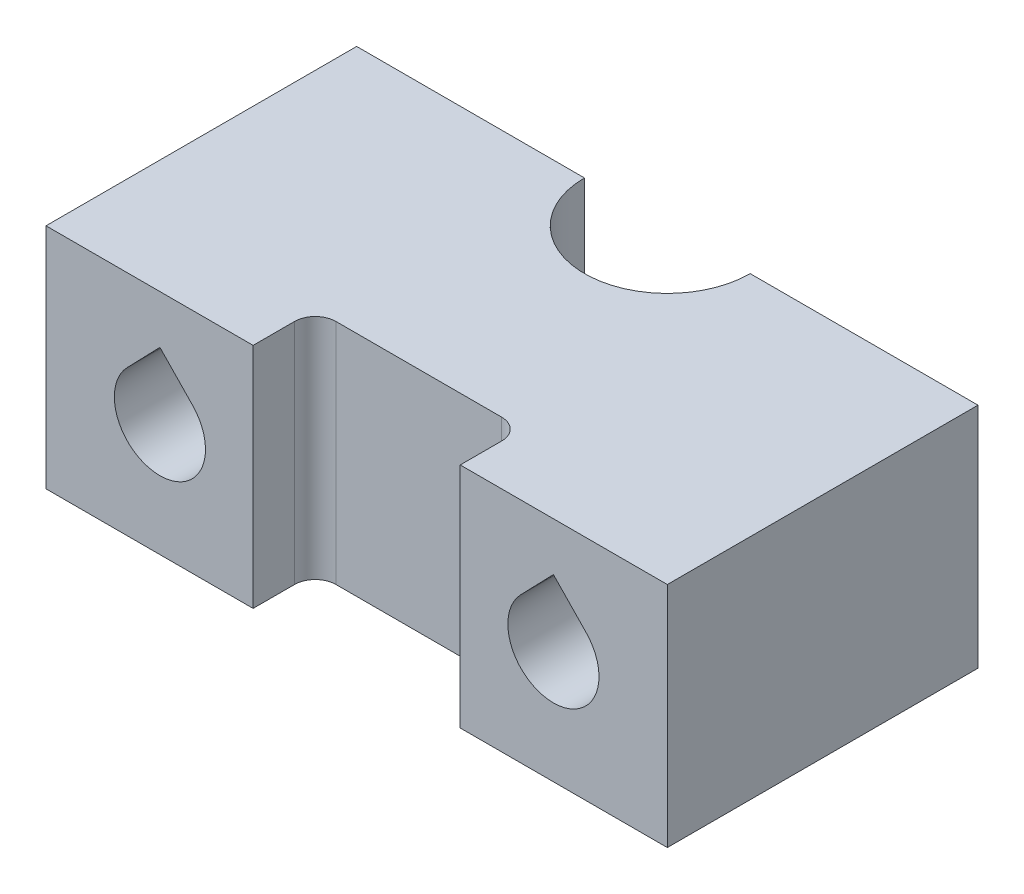
ISO-10303-21;
HEADER;
FILE_DESCRIPTION(('STEP AP214'),'2;1');
FILE_NAME('part.step','',(''),(''),'','','');
FILE_SCHEMA(('AUTOMOTIVE_DESIGN { 1 0 10303 214 1 1 1 1 }'));
ENDSEC;
DATA;
#1=APPLICATION_CONTEXT('core data for automotive mechanical design processes');
#2=APPLICATION_PROTOCOL_DEFINITION('international standard','automotive_design',2000,#1);
#3=PRODUCT_CONTEXT('',#1,'mechanical');
#4=PRODUCT('Part','Part','',(#3));
#5=PRODUCT_RELATED_PRODUCT_CATEGORY('part','',(#4));
#6=PRODUCT_DEFINITION_FORMATION('','',#4);
#7=PRODUCT_DEFINITION_CONTEXT('part definition',#1,'design');
#8=PRODUCT_DEFINITION('design','',#6,#7);
#9=PRODUCT_DEFINITION_SHAPE('','',#8);
#10=(LENGTH_UNIT() NAMED_UNIT(*) SI_UNIT(.MILLI.,.METRE.));
#11=(NAMED_UNIT(*) PLANE_ANGLE_UNIT() SI_UNIT($,.RADIAN.));
#12=(NAMED_UNIT(*) SI_UNIT($,.STERADIAN.) SOLID_ANGLE_UNIT());
#13=UNCERTAINTY_MEASURE_WITH_UNIT(LENGTH_MEASURE(1.E-05),#10,'distance_accuracy_value','');
#14=(GEOMETRIC_REPRESENTATION_CONTEXT(3) GLOBAL_UNCERTAINTY_ASSIGNED_CONTEXT((#13)) GLOBAL_UNIT_ASSIGNED_CONTEXT((#10,
#11,#12)) REPRESENTATION_CONTEXT('',''));
#15=CARTESIAN_POINT('',(0.,0.,0.));
#16=DIRECTION('',(0.,0.,1.));
#17=DIRECTION('',(1.,0.,0.));
#18=AXIS2_PLACEMENT_3D('',#15,#16,#17);
#19=CARTESIAN_POINT('',(-49.5000000000001,-25.4999999999999,25.0000000000001));
#20=DIRECTION('',(0.,0.,-1.));
#21=DIRECTION('',(-1.,0.,0.));
#22=AXIS2_PLACEMENT_3D('',#19,#20,#21);
#23=PLANE('',#22);
#24=DIRECTION('',(0.,-1.,0.));
#25=VECTOR('',#24,1.);
#26=CARTESIAN_POINT('',(-30.5,-36.4999999999999,25.0000000000001));
#27=LINE('',#26,#25);
#28=CARTESIAN_POINT('',(-30.5,-25.4999999999999,25.0000000000001));
#29=VERTEX_POINT('',#28);
#30=CARTESIAN_POINT('',(-30.5,-36.4999999999999,25.0000000000001));
#31=VERTEX_POINT('',#30);
#32=EDGE_CURVE('E156',#29,#31,#27,.T.);
#33=ORIENTED_EDGE('',*,*,#32,.F.);
#34=DIRECTION('',(1.,0.,0.));
#35=VECTOR('',#34,1.);
#36=CARTESIAN_POINT('',(-49.5000000000001,-25.4999999999999,25.0000000000001));
#37=LINE('',#36,#35);
#38=CARTESIAN_POINT('',(-19.4999999999998,-25.4999999999999,25.0000000000001));
#39=VERTEX_POINT('',#38);
#40=EDGE_CURVE('E169',#29,#39,#37,.T.);
#41=ORIENTED_EDGE('',*,*,#40,.T.);
#42=DIRECTION('',(0.,-1.,0.));
#43=VECTOR('',#42,1.);
#44=CARTESIAN_POINT('',(-19.4999999999998,-25.4999999999999,25.0000000000001));
#45=LINE('',#44,#43);
#46=CARTESIAN_POINT('',(-19.4999999999998,-36.4999999999999,25.0000000000001));
#47=VERTEX_POINT('',#46);
#48=EDGE_CURVE('E197',#39,#47,#45,.T.);
#49=ORIENTED_EDGE('',*,*,#48,.T.);
#50=DIRECTION('',(1.,0.,0.));
#51=VECTOR('',#50,1.);
#52=CARTESIAN_POINT('',(-49.5000000000001,-36.4999999999999,25.0000000000001));
#53=LINE('',#52,#51);
#54=EDGE_CURVE('E171',#31,#47,#53,.T.);
#55=ORIENTED_EDGE('',*,*,#54,.F.);
#56=EDGE_LOOP('',(#33,#41,#49,#55));
#57=FACE_BOUND('',#56,.T.);
#58=DIRECTION('',(-0.694658370458998,0.719339800338651,0.));
#59=VECTOR('',#58,1.);
#60=CARTESIAN_POINT('',(-23.4174524392547,-29.4717515849901,25.0000000000001));
#61=LINE('',#60,#59);
#62=CARTESIAN_POINT('',(-23.4174524392547,-29.4717515849901,25.0000000000001));
#63=VERTEX_POINT('',#62);
#64=CARTESIAN_POINT('',(-24.9999999999997,-27.8329756128233,25.0000000000001));
#65=VERTEX_POINT('',#64);
#66=EDGE_CURVE('E294',#63,#65,#61,.T.);
#67=ORIENTED_EDGE('',*,*,#66,.T.);
#68=DIRECTION('',(-0.694658370458998,-0.719339800338651,0.));
#69=VECTOR('',#68,1.);
#70=CARTESIAN_POINT('',(-24.9999999999997,-27.8329756128233,25.0000000000001));
#71=LINE('',#70,#69);
#72=CARTESIAN_POINT('',(-26.5825475607448,-29.4717515849901,25.0000000000001));
#73=VERTEX_POINT('',#72);
#74=EDGE_CURVE('E301',#65,#73,#71,.T.);
#75=ORIENTED_EDGE('',*,*,#74,.T.);
#76=CARTESIAN_POINT('',(-24.9999999999997,-30.9999999999999,25.0000000000001));
#77=DIRECTION('',(0.,0.,1.));
#78=DIRECTION('',(1.,0.,0.));
#79=AXIS2_PLACEMENT_3D('',#76,#77,#78);
#80=CIRCLE('',#79,2.2);
#81=EDGE_CURVE('E288',#73,#63,#80,.T.);
#82=ORIENTED_EDGE('',*,*,#81,.T.);
#83=EDGE_LOOP('',(#67,#75,#82));
#84=FACE_BOUND('',#83,.T.);
#85=ADVANCED_FACE('F30',(#57,#84),#23,.T.);
#86=CARTESIAN_POINT('',(-19.4999999999998,-25.4999999999999,40.0000000000001));
#87=DIRECTION('',(0.,0.,1.));
#88=DIRECTION('',(1.,0.,0.));
#89=AXIS2_PLACEMENT_3D('',#86,#87,#88);
#90=PLANE('',#89);
#91=CARTESIAN_POINT('',(-44.0000000000003,-30.9999999999999,40.0000000000001));
#92=DIRECTION('',(0.,0.,-1.));
#93=DIRECTION('',(-1.,0.,0.));
#94=AXIS2_PLACEMENT_3D('',#91,#92,#93);
#95=CIRCLE('',#94,2.2);
#96=CARTESIAN_POINT('',(-42.4174524392553,-29.4717515849901,40.0000000000001));
#97=VERTEX_POINT('',#96);
#98=CARTESIAN_POINT('',(-45.5825475607453,-29.4717515849901,40.0000000000001));
#99=VERTEX_POINT('',#98);
#100=EDGE_CURVE('E270',#97,#99,#95,.T.);
#101=ORIENTED_EDGE('',*,*,#100,.T.);
#102=DIRECTION('',(0.694658370458997,0.719339800338652,0.));
#103=VECTOR('',#102,1.);
#104=CARTESIAN_POINT('',(-45.5825475607453,-29.4717515849901,40.0000000000001));
#105=LINE('',#104,#103);
#106=CARTESIAN_POINT('',(-44.0000000000003,-27.8329756128233,40.0000000000001));
#107=VERTEX_POINT('',#106);
#108=EDGE_CURVE('E279',#99,#107,#105,.T.);
#109=ORIENTED_EDGE('',*,*,#108,.T.);
#110=DIRECTION('',(0.694658370458997,-0.719339800338652,0.));
#111=VECTOR('',#110,1.);
#112=CARTESIAN_POINT('',(-44.0000000000003,-27.8329756128233,40.0000000000001));
#113=LINE('',#112,#111);
#114=EDGE_CURVE('E264',#107,#97,#113,.T.);
#115=ORIENTED_EDGE('',*,*,#114,.T.);
#116=EDGE_LOOP('',(#101,#109,#115));
#117=FACE_BOUND('',#116,.T.);
#118=DIRECTION('',(0.,1.,0.));
#119=VECTOR('',#118,1.);
#120=CARTESIAN_POINT('',(-39.5,-36.4999999999999,40.0000000000001));
#121=LINE('',#120,#119);
#122=CARTESIAN_POINT('',(-39.5,-36.4999999999999,40.0000000000001));
#123=VERTEX_POINT('',#122);
#124=CARTESIAN_POINT('',(-39.5,-25.4999999999999,40.0000000000001));
#125=VERTEX_POINT('',#124);
#126=EDGE_CURVE('E247',#123,#125,#121,.T.);
#127=ORIENTED_EDGE('',*,*,#126,.T.);
#128=DIRECTION('',(-1.,0.,0.));
#129=VECTOR('',#128,1.);
#130=CARTESIAN_POINT('',(-19.4999999999998,-25.4999999999999,40.0000000000001));
#131=LINE('',#130,#129);
#132=CARTESIAN_POINT('',(-49.5000000000001,-25.4999999999999,40.0000000000001));
#133=VERTEX_POINT('',#132);
#134=EDGE_CURVE('E190',#125,#133,#131,.T.);
#135=ORIENTED_EDGE('',*,*,#134,.T.);
#136=DIRECTION('',(0.,-1.,0.));
#137=VECTOR('',#136,1.);
#138=CARTESIAN_POINT('',(-49.5000000000001,-25.4999999999999,40.0000000000001));
#139=LINE('',#138,#137);
#140=CARTESIAN_POINT('',(-49.5000000000001,-36.4999999999999,40.0000000000001));
#141=VERTEX_POINT('',#140);
#142=EDGE_CURVE('E210',#133,#141,#139,.T.);
#143=ORIENTED_EDGE('',*,*,#142,.T.);
#144=DIRECTION('',(-1.,0.,0.));
#145=VECTOR('',#144,1.);
#146=CARTESIAN_POINT('',(-19.4999999999998,-36.4999999999999,40.0000000000001));
#147=LINE('',#146,#145);
#148=EDGE_CURVE('E204',#123,#141,#147,.T.);
#149=ORIENTED_EDGE('',*,*,#148,.F.);
#150=EDGE_LOOP('',(#127,#135,#143,#149));
#151=FACE_BOUND('',#150,.T.);
#152=ADVANCED_FACE('F317',(#117,#151),#90,.T.);
#153=DIRECTION('',(0.,-1.,0.));
#154=VECTOR('',#153,1.);
#155=CARTESIAN_POINT('',(-38.5,-36.4999999999999,25.0000000000001));
#156=LINE('',#155,#154);
#157=CARTESIAN_POINT('',(-38.5,-36.4999999999999,25.0000000000001));
#158=VERTEX_POINT('',#157);
#159=CARTESIAN_POINT('',(-38.5,-25.4999999999999,25.0000000000001));
#160=VERTEX_POINT('',#159);
#161=EDGE_CURVE('E159',#158,#160,#156,.F.);
#162=ORIENTED_EDGE('',*,*,#161,.F.);
#163=CARTESIAN_POINT('',(-49.5000000000001,-36.4999999999999,25.0000000000001));
#164=VERTEX_POINT('',#163);
#165=EDGE_CURVE('E198',#164,#158,#53,.T.);
#166=ORIENTED_EDGE('',*,*,#165,.F.);
#167=DIRECTION('',(0.,-1.,0.));
#168=VECTOR('',#167,1.);
#169=CARTESIAN_POINT('',(-49.5000000000001,-25.4999999999999,25.0000000000001));
#170=LINE('',#169,#168);
#171=CARTESIAN_POINT('',(-49.5000000000001,-25.4999999999999,25.0000000000001));
#172=VERTEX_POINT('',#171);
#173=EDGE_CURVE('E207',#172,#164,#170,.T.);
#174=ORIENTED_EDGE('',*,*,#173,.F.);
#175=EDGE_CURVE('E179',#172,#160,#37,.T.);
#176=ORIENTED_EDGE('',*,*,#175,.T.);
#177=EDGE_LOOP('',(#162,#166,#174,#176));
#178=FACE_BOUND('',#177,.T.);
#179=CARTESIAN_POINT('',(-44.0000000000003,-30.9999999999999,25.0000000000001));
#180=DIRECTION('',(0.,0.,-1.));
#181=DIRECTION('',(-1.,0.,0.));
#182=AXIS2_PLACEMENT_3D('',#179,#180,#181);
#183=CIRCLE('',#182,2.2);
#184=CARTESIAN_POINT('',(-42.4174524392553,-29.4717515849901,25.0000000000001));
#185=VERTEX_POINT('',#184);
#186=CARTESIAN_POINT('',(-45.5825475607453,-29.4717515849901,25.0000000000001));
#187=VERTEX_POINT('',#186);
#188=EDGE_CURVE('E274',#185,#187,#183,.T.);
#189=ORIENTED_EDGE('',*,*,#188,.F.);
#190=DIRECTION('',(0.694658370458997,-0.719339800338652,0.));
#191=VECTOR('',#190,1.);
#192=CARTESIAN_POINT('',(-44.0000000000003,-27.8329756128233,25.0000000000001));
#193=LINE('',#192,#191);
#194=CARTESIAN_POINT('',(-44.0000000000003,-27.8329756128233,25.0000000000001));
#195=VERTEX_POINT('',#194);
#196=EDGE_CURVE('E267',#195,#185,#193,.T.);
#197=ORIENTED_EDGE('',*,*,#196,.F.);
#198=DIRECTION('',(0.694658370458997,0.719339800338652,0.));
#199=VECTOR('',#198,1.);
#200=CARTESIAN_POINT('',(-45.5825475607453,-29.4717515849901,25.0000000000001));
#201=LINE('',#200,#199);
#202=EDGE_CURVE('E271',#187,#195,#201,.T.);
#203=ORIENTED_EDGE('',*,*,#202,.F.);
#204=EDGE_LOOP('',(#189,#197,#203));
#205=FACE_BOUND('',#204,.T.);
#206=ADVANCED_FACE('F309',(#178,#205),#23,.T.);
#207=CARTESIAN_POINT('',(-49.5000000000001,-25.4999999999999,40.0000000000001));
#208=DIRECTION('',(-1.,0.,0.));
#209=DIRECTION('',(0.,0.,1.));
#210=AXIS2_PLACEMENT_3D('',#207,#208,#209);
#211=PLANE('',#210);
#212=DIRECTION('',(0.,0.,-1.));
#213=VECTOR('',#212,1.);
#214=CARTESIAN_POINT('',(-49.5000000000001,-36.4999999999999,40.0000000000001));
#215=LINE('',#214,#213);
#216=EDGE_CURVE('E180',#141,#164,#215,.T.);
#217=ORIENTED_EDGE('',*,*,#216,.F.);
#218=ORIENTED_EDGE('',*,*,#142,.F.);
#219=DIRECTION('',(0.,0.,-1.));
#220=VECTOR('',#219,1.);
#221=CARTESIAN_POINT('',(-49.5000000000001,-25.4999999999999,40.0000000000001));
#222=LINE('',#221,#220);
#223=EDGE_CURVE('E194',#133,#172,#222,.T.);
#224=ORIENTED_EDGE('',*,*,#223,.T.);
#225=ORIENTED_EDGE('',*,*,#173,.T.);
#226=EDGE_LOOP('',(#217,#218,#224,#225));
#227=FACE_BOUND('',#226,.T.);
#228=ADVANCED_FACE('F315',(#227),#211,.T.);
#229=DIRECTION('',(-0.694658370458998,0.719339800338651,0.));
#230=VECTOR('',#229,1.);
#231=CARTESIAN_POINT('',(-23.4174524392547,-29.4717515849901,40.0000000000001));
#232=LINE('',#231,#230);
#233=CARTESIAN_POINT('',(-23.4174524392547,-29.4717515849901,40.0000000000001));
#234=VERTEX_POINT('',#233);
#235=CARTESIAN_POINT('',(-24.9999999999997,-27.8329756128233,40.0000000000001));
#236=VERTEX_POINT('',#235);
#237=EDGE_CURVE('E172',#234,#236,#232,.T.);
#238=ORIENTED_EDGE('',*,*,#237,.F.);
#239=CARTESIAN_POINT('',(-24.9999999999997,-30.9999999999999,40.0000000000001));
#240=DIRECTION('',(0.,0.,1.));
#241=DIRECTION('',(1.,0.,0.));
#242=AXIS2_PLACEMENT_3D('',#239,#240,#241);
#243=CIRCLE('',#242,2.2);
#244=CARTESIAN_POINT('',(-26.5825475607448,-29.4717515849901,40.0000000000001));
#245=VERTEX_POINT('',#244);
#246=EDGE_CURVE('E291',#245,#234,#243,.T.);
#247=ORIENTED_EDGE('',*,*,#246,.F.);
#248=DIRECTION('',(-0.694658370458998,-0.719339800338651,0.));
#249=VECTOR('',#248,1.);
#250=CARTESIAN_POINT('',(-24.9999999999997,-27.8329756128233,40.0000000000001));
#251=LINE('',#250,#249);
#252=EDGE_CURVE('E295',#236,#245,#251,.T.);
#253=ORIENTED_EDGE('',*,*,#252,.F.);
#254=EDGE_LOOP('',(#238,#247,#253));
#255=FACE_BOUND('',#254,.T.);
#256=DIRECTION('',(0.,1.,0.));
#257=VECTOR('',#256,1.);
#258=CARTESIAN_POINT('',(-29.5,-36.4999999999999,40.0000000000001));
#259=LINE('',#258,#257);
#260=CARTESIAN_POINT('',(-29.5,-36.4999999999999,40.0000000000001));
#261=VERTEX_POINT('',#260);
#262=CARTESIAN_POINT('',(-29.5,-25.4999999999999,40.0000000000001));
#263=VERTEX_POINT('',#262);
#264=EDGE_CURVE('E187',#261,#263,#259,.T.);
#265=ORIENTED_EDGE('',*,*,#264,.F.);
#266=CARTESIAN_POINT('',(-19.4999999999998,-36.4999999999999,40.0000000000001));
#267=VERTEX_POINT('',#266);
#268=EDGE_CURVE('E183',#267,#261,#147,.T.);
#269=ORIENTED_EDGE('',*,*,#268,.F.);
#270=DIRECTION('',(0.,-1.,0.));
#271=VECTOR('',#270,1.);
#272=CARTESIAN_POINT('',(-19.4999999999998,-25.4999999999999,40.0000000000001));
#273=LINE('',#272,#271);
#274=CARTESIAN_POINT('',(-19.4999999999998,-25.4999999999999,40.0000000000001));
#275=VERTEX_POINT('',#274);
#276=EDGE_CURVE('E213',#275,#267,#273,.T.);
#277=ORIENTED_EDGE('',*,*,#276,.F.);
#278=EDGE_CURVE('E191',#275,#263,#131,.T.);
#279=ORIENTED_EDGE('',*,*,#278,.T.);
#280=EDGE_LOOP('',(#265,#269,#277,#279));
#281=FACE_BOUND('',#280,.T.);
#282=ADVANCED_FACE('F321',(#255,#281),#90,.T.);
#283=CARTESIAN_POINT('',(-19.4999999999998,-25.4999999999999,25.0000000000001));
#284=DIRECTION('',(1.,0.,0.));
#285=DIRECTION('',(0.,0.,-1.));
#286=AXIS2_PLACEMENT_3D('',#283,#284,#285);
#287=PLANE('',#286);
#288=DIRECTION('',(0.,0.,1.));
#289=VECTOR('',#288,1.);
#290=CARTESIAN_POINT('',(-19.4999999999998,-36.4999999999999,25.0000000000001));
#291=LINE('',#290,#289);
#292=EDGE_CURVE('E201',#47,#267,#291,.T.);
#293=ORIENTED_EDGE('',*,*,#292,.F.);
#294=ORIENTED_EDGE('',*,*,#48,.F.);
#295=DIRECTION('',(0.,0.,1.));
#296=VECTOR('',#295,1.);
#297=CARTESIAN_POINT('',(-19.4999999999998,-25.4999999999999,25.0000000000001));
#298=LINE('',#297,#296);
#299=EDGE_CURVE('E178',#39,#275,#298,.T.);
#300=ORIENTED_EDGE('',*,*,#299,.T.);
#301=ORIENTED_EDGE('',*,*,#276,.T.);
#302=EDGE_LOOP('',(#293,#294,#300,#301));
#303=FACE_BOUND('',#302,.T.);
#304=ADVANCED_FACE('F330',(#303),#287,.T.);
#305=CARTESIAN_POINT('',(-19.4999999999998,-25.4999999999999,25.0000000000001));
#306=DIRECTION('',(0.,-1.,0.));
#307=DIRECTION('',(0.,0.,-1.));
#308=AXIS2_PLACEMENT_3D('',#305,#306,#307);
#309=PLANE('',#308);
#310=ORIENTED_EDGE('',*,*,#40,.F.);
#311=CARTESIAN_POINT('',(-34.5,-25.4999999999999,25.0000000000001));
#312=DIRECTION('',(0.,-1.,0.));
#313=DIRECTION('',(0.,0.,-1.));
#314=AXIS2_PLACEMENT_3D('',#311,#312,#313);
#315=CIRCLE('',#314,4.00000000000001);
#316=EDGE_CURVE('E153',#29,#160,#315,.T.);
#317=ORIENTED_EDGE('',*,*,#316,.T.);
#318=ORIENTED_EDGE('',*,*,#175,.F.);
#319=ORIENTED_EDGE('',*,*,#223,.F.);
#320=ORIENTED_EDGE('',*,*,#134,.F.);
#321=DIRECTION('',(0.,0.,1.));
#322=VECTOR('',#321,1.);
#323=CARTESIAN_POINT('',(-39.5,-25.4999999999999,37.0000000000001));
#324=LINE('',#323,#322);
#325=CARTESIAN_POINT('',(-39.5,-25.4999999999999,38.0000000000001));
#326=VERTEX_POINT('',#325);
#327=EDGE_CURVE('E239',#326,#125,#324,.T.);
#328=ORIENTED_EDGE('',*,*,#327,.F.);
#329=CARTESIAN_POINT('',(-38.5,-25.4999999999999,38.0000000000001));
#330=DIRECTION('',(0.,-1.,0.));
#331=DIRECTION('',(0.,0.,-1.));
#332=AXIS2_PLACEMENT_3D('',#329,#330,#331);
#333=CIRCLE('',#332,1.);
#334=CARTESIAN_POINT('',(-38.5,-25.4999999999999,37.0000000000001));
#335=VERTEX_POINT('',#334);
#336=EDGE_CURVE('E221',#326,#335,#333,.T.);
#337=ORIENTED_EDGE('',*,*,#336,.T.);
#338=DIRECTION('',(-1.,0.,0.));
#339=VECTOR('',#338,1.);
#340=CARTESIAN_POINT('',(-29.5,-25.4999999999999,37.0000000000001));
#341=LINE('',#340,#339);
#342=CARTESIAN_POINT('',(-30.5,-25.4999999999999,37.0000000000001));
#343=VERTEX_POINT('',#342);
#344=EDGE_CURVE('E233',#343,#335,#341,.T.);
#345=ORIENTED_EDGE('',*,*,#344,.F.);
#346=CARTESIAN_POINT('',(-30.5,-25.4999999999999,38.0000000000001));
#347=DIRECTION('',(0.,-1.,0.));
#348=DIRECTION('',(0.,0.,-1.));
#349=AXIS2_PLACEMENT_3D('',#346,#347,#348);
#350=CIRCLE('',#349,1.);
#351=CARTESIAN_POINT('',(-29.5,-25.4999999999999,38.0000000000001));
#352=VERTEX_POINT('',#351);
#353=EDGE_CURVE('E38',#343,#352,#350,.T.);
#354=ORIENTED_EDGE('',*,*,#353,.T.);
#355=DIRECTION('',(0.,0.,-1.));
#356=VECTOR('',#355,1.);
#357=CARTESIAN_POINT('',(-29.5,-25.4999999999999,40.0000000000001));
#358=LINE('',#357,#356);
#359=EDGE_CURVE('E240',#263,#352,#358,.T.);
#360=ORIENTED_EDGE('',*,*,#359,.F.);
#361=ORIENTED_EDGE('',*,*,#278,.F.);
#362=ORIENTED_EDGE('',*,*,#299,.F.);
#363=EDGE_LOOP('',(#310,#317,#318,#319,#320,#328,#337,#345,#354,#360,#361,#362));
#364=FACE_BOUND('',#363,.T.);
#365=ADVANCED_FACE('F175',(#364),#309,.F.);
#366=CARTESIAN_POINT('',(-19.4999999999998,-36.4999999999999,25.0000000000001));
#367=DIRECTION('',(0.,-1.,0.));
#368=DIRECTION('',(0.,0.,-1.));
#369=AXIS2_PLACEMENT_3D('',#366,#367,#368);
#370=PLANE('',#369);
#371=CARTESIAN_POINT('',(-34.5,-36.4999999999999,25.0000000000001));
#372=DIRECTION('',(0.,-1.,0.));
#373=DIRECTION('',(0.,0.,-1.));
#374=AXIS2_PLACEMENT_3D('',#371,#372,#373);
#375=CIRCLE('',#374,4.00000000000001);
#376=EDGE_CURVE('E163',#31,#158,#375,.T.);
#377=ORIENTED_EDGE('',*,*,#376,.F.);
#378=ORIENTED_EDGE('',*,*,#54,.T.);
#379=ORIENTED_EDGE('',*,*,#292,.T.);
#380=ORIENTED_EDGE('',*,*,#268,.T.);
#381=DIRECTION('',(0.,0.,-1.));
#382=VECTOR('',#381,1.);
#383=CARTESIAN_POINT('',(-29.5,-36.4999999999999,40.0000000000001));
#384=LINE('',#383,#382);
#385=CARTESIAN_POINT('',(-29.5,-36.4999999999999,38.0000000000001));
#386=VERTEX_POINT('',#385);
#387=EDGE_CURVE('E242',#261,#386,#384,.T.);
#388=ORIENTED_EDGE('',*,*,#387,.T.);
#389=CARTESIAN_POINT('',(-30.5,-36.4999999999999,38.0000000000001));
#390=DIRECTION('',(0.,-1.,0.));
#391=DIRECTION('',(0.,0.,-1.));
#392=AXIS2_PLACEMENT_3D('',#389,#390,#391);
#393=CIRCLE('',#392,1.);
#394=CARTESIAN_POINT('',(-30.5,-36.4999999999999,37.0000000000001));
#395=VERTEX_POINT('',#394);
#396=EDGE_CURVE('E11',#386,#395,#393,.F.);
#397=ORIENTED_EDGE('',*,*,#396,.T.);
#398=DIRECTION('',(-1.,0.,0.));
#399=VECTOR('',#398,1.);
#400=CARTESIAN_POINT('',(-29.5,-36.4999999999999,37.0000000000001));
#401=LINE('',#400,#399);
#402=CARTESIAN_POINT('',(-38.5,-36.4999999999999,37.0000000000001));
#403=VERTEX_POINT('',#402);
#404=EDGE_CURVE('E234',#395,#403,#401,.T.);
#405=ORIENTED_EDGE('',*,*,#404,.T.);
#406=CARTESIAN_POINT('',(-38.5,-36.4999999999999,38.0000000000001));
#407=DIRECTION('',(0.,-1.,0.));
#408=DIRECTION('',(0.,0.,-1.));
#409=AXIS2_PLACEMENT_3D('',#406,#407,#408);
#410=CIRCLE('',#409,1.);
#411=CARTESIAN_POINT('',(-39.5,-36.4999999999999,38.0000000000001));
#412=VERTEX_POINT('',#411);
#413=EDGE_CURVE('E224',#403,#412,#410,.F.);
#414=ORIENTED_EDGE('',*,*,#413,.T.);
#415=DIRECTION('',(0.,0.,1.));
#416=VECTOR('',#415,1.);
#417=CARTESIAN_POINT('',(-39.5,-36.4999999999999,37.0000000000001));
#418=LINE('',#417,#416);
#419=EDGE_CURVE('E253',#412,#123,#418,.T.);
#420=ORIENTED_EDGE('',*,*,#419,.T.);
#421=ORIENTED_EDGE('',*,*,#148,.T.);
#422=ORIENTED_EDGE('',*,*,#216,.T.);
#423=ORIENTED_EDGE('',*,*,#165,.T.);
#424=EDGE_LOOP('',(#377,#378,#379,#380,#388,#397,#405,#414,#420,#421,#422,#423));
#425=FACE_BOUND('',#424,.T.);
#426=ADVANCED_FACE('F311',(#425),#370,.T.);
#427=CARTESIAN_POINT('',(-39.5,-36.4999999999999,37.0000000000001));
#428=DIRECTION('',(-1.,0.,0.));
#429=DIRECTION('',(0.,0.,1.));
#430=AXIS2_PLACEMENT_3D('',#427,#428,#429);
#431=PLANE('',#430);
#432=ORIENTED_EDGE('',*,*,#419,.F.);
#433=DIRECTION('',(0.,1.,0.));
#434=VECTOR('',#433,1.);
#435=CARTESIAN_POINT('',(-39.5,-25.4999999999999,38.0000000000001));
#436=LINE('',#435,#434);
#437=EDGE_CURVE('E209',#412,#326,#436,.T.);
#438=ORIENTED_EDGE('',*,*,#437,.T.);
#439=ORIENTED_EDGE('',*,*,#327,.T.);
#440=ORIENTED_EDGE('',*,*,#126,.F.);
#441=EDGE_LOOP('',(#432,#438,#439,#440));
#442=FACE_BOUND('',#441,.T.);
#443=ADVANCED_FACE('F349',(#442),#431,.F.);
#444=CARTESIAN_POINT('',(-29.5,-36.4999999999999,37.0000000000001));
#445=DIRECTION('',(0.,0.,-1.));
#446=DIRECTION('',(-1.,0.,0.));
#447=AXIS2_PLACEMENT_3D('',#444,#445,#446);
#448=PLANE('',#447);
#449=ORIENTED_EDGE('',*,*,#404,.F.);
#450=DIRECTION('',(0.,1.,0.));
#451=VECTOR('',#450,1.);
#452=CARTESIAN_POINT('',(-30.5,-25.4999999999999,37.0000000000001));
#453=LINE('',#452,#451);
#454=EDGE_CURVE('E226',#395,#343,#453,.T.);
#455=ORIENTED_EDGE('',*,*,#454,.T.);
#456=ORIENTED_EDGE('',*,*,#344,.T.);
#457=DIRECTION('',(0.,1.,0.));
#458=VECTOR('',#457,1.);
#459=CARTESIAN_POINT('',(-38.5,-36.4999999999999,37.0000000000001));
#460=LINE('',#459,#458);
#461=EDGE_CURVE('E218',#335,#403,#460,.F.);
#462=ORIENTED_EDGE('',*,*,#461,.T.);
#463=EDGE_LOOP('',(#449,#455,#456,#462));
#464=FACE_BOUND('',#463,.T.);
#465=ADVANCED_FACE('F232',(#464),#448,.F.);
#466=CARTESIAN_POINT('',(-29.5,-36.4999999999999,40.0000000000001));
#467=DIRECTION('',(1.,0.,0.));
#468=DIRECTION('',(0.,0.,-1.));
#469=AXIS2_PLACEMENT_3D('',#466,#467,#468);
#470=PLANE('',#469);
#471=ORIENTED_EDGE('',*,*,#359,.T.);
#472=DIRECTION('',(0.,1.,0.));
#473=VECTOR('',#472,1.);
#474=CARTESIAN_POINT('',(-29.5,-36.4999999999999,38.0000000000001));
#475=LINE('',#474,#473);
#476=EDGE_CURVE('E45',#352,#386,#475,.F.);
#477=ORIENTED_EDGE('',*,*,#476,.T.);
#478=ORIENTED_EDGE('',*,*,#387,.F.);
#479=ORIENTED_EDGE('',*,*,#264,.T.);
#480=EDGE_LOOP('',(#471,#477,#478,#479));
#481=FACE_BOUND('',#480,.T.);
#482=ADVANCED_FACE('F343',(#481),#470,.F.);
#483=CARTESIAN_POINT('',(-44.0000000000003,-30.9999999999999,40.0000000000001));
#484=DIRECTION('',(0.,0.,-1.));
#485=DIRECTION('',(-1.,0.,0.));
#486=AXIS2_PLACEMENT_3D('',#483,#484,#485);
#487=CYLINDRICAL_SURFACE('',#486,2.2);
#488=ORIENTED_EDGE('',*,*,#188,.T.);
#489=DIRECTION('',(0.,0.,-1.));
#490=VECTOR('',#489,1.);
#491=CARTESIAN_POINT('',(-45.5825475607453,-29.4717515849901,40.0000000000001));
#492=LINE('',#491,#490);
#493=EDGE_CURVE('E260',#99,#187,#492,.T.);
#494=ORIENTED_EDGE('',*,*,#493,.F.);
#495=ORIENTED_EDGE('',*,*,#100,.F.);
#496=DIRECTION('',(0.,0.,-1.));
#497=VECTOR('',#496,1.);
#498=CARTESIAN_POINT('',(-42.4174524392553,-29.4717515849901,40.0000000000001));
#499=LINE('',#498,#497);
#500=EDGE_CURVE('E244',#97,#185,#499,.T.);
#501=ORIENTED_EDGE('',*,*,#500,.T.);
#502=EDGE_LOOP('',(#488,#494,#495,#501));
#503=FACE_BOUND('',#502,.T.);
#504=ADVANCED_FACE('F359',(#503),#487,.F.);
#505=CARTESIAN_POINT('',(-44.0000000000003,-27.8329756128233,40.0000000000001));
#506=DIRECTION('',(0.719339800338652,0.694658370458997,0.));
#507=DIRECTION('',(-0.694658370458997,0.719339800338652,0.));
#508=AXIS2_PLACEMENT_3D('',#505,#506,#507);
#509=PLANE('',#508);
#510=ORIENTED_EDGE('',*,*,#196,.T.);
#511=ORIENTED_EDGE('',*,*,#500,.F.);
#512=ORIENTED_EDGE('',*,*,#114,.F.);
#513=DIRECTION('',(0.,0.,-1.));
#514=VECTOR('',#513,1.);
#515=CARTESIAN_POINT('',(-44.0000000000003,-27.8329756128233,40.0000000000001));
#516=LINE('',#515,#514);
#517=EDGE_CURVE('E263',#107,#195,#516,.T.);
#518=ORIENTED_EDGE('',*,*,#517,.T.);
#519=EDGE_LOOP('',(#510,#511,#512,#518));
#520=FACE_BOUND('',#519,.T.);
#521=ADVANCED_FACE('F442',(#520),#509,.F.);
#522=CARTESIAN_POINT('',(-45.5825475607453,-29.4717515849901,40.0000000000001));
#523=DIRECTION('',(-0.719339800338652,0.694658370458997,0.));
#524=DIRECTION('',(-0.694658370458997,-0.719339800338652,0.));
#525=AXIS2_PLACEMENT_3D('',#522,#523,#524);
#526=PLANE('',#525);
#527=ORIENTED_EDGE('',*,*,#202,.T.);
#528=ORIENTED_EDGE('',*,*,#517,.F.);
#529=ORIENTED_EDGE('',*,*,#108,.F.);
#530=ORIENTED_EDGE('',*,*,#493,.T.);
#531=EDGE_LOOP('',(#527,#528,#529,#530));
#532=FACE_BOUND('',#531,.T.);
#533=ADVANCED_FACE('F434',(#532),#526,.F.);
#534=CARTESIAN_POINT('',(-23.4174524392547,-29.4717515849901,25.0000000000001));
#535=DIRECTION('',(0.719339800338651,0.694658370458997,0.));
#536=DIRECTION('',(-0.694658370458998,0.719339800338651,0.));
#537=AXIS2_PLACEMENT_3D('',#534,#535,#536);
#538=PLANE('',#537);
#539=ORIENTED_EDGE('',*,*,#237,.T.);
#540=DIRECTION('',(0.,0.,1.));
#541=VECTOR('',#540,1.);
#542=CARTESIAN_POINT('',(-24.9999999999997,-27.8329756128233,25.0000000000001));
#543=LINE('',#542,#541);
#544=EDGE_CURVE('E284',#65,#236,#543,.T.);
#545=ORIENTED_EDGE('',*,*,#544,.F.);
#546=ORIENTED_EDGE('',*,*,#66,.F.);
#547=DIRECTION('',(0.,0.,1.));
#548=VECTOR('',#547,1.);
#549=CARTESIAN_POINT('',(-23.4174524392547,-29.4717515849901,25.0000000000001));
#550=LINE('',#549,#548);
#551=EDGE_CURVE('E276',#63,#234,#550,.T.);
#552=ORIENTED_EDGE('',*,*,#551,.T.);
#553=EDGE_LOOP('',(#539,#545,#546,#552));
#554=FACE_BOUND('',#553,.T.);
#555=ADVANCED_FACE('F426',(#554),#538,.F.);
#556=CARTESIAN_POINT('',(-24.9999999999997,-30.9999999999999,25.0000000000001));
#557=DIRECTION('',(0.,0.,1.));
#558=DIRECTION('',(1.,0.,0.));
#559=AXIS2_PLACEMENT_3D('',#556,#557,#558);
#560=CYLINDRICAL_SURFACE('',#559,2.2);
#561=ORIENTED_EDGE('',*,*,#246,.T.);
#562=ORIENTED_EDGE('',*,*,#551,.F.);
#563=ORIENTED_EDGE('',*,*,#81,.F.);
#564=DIRECTION('',(0.,0.,1.));
#565=VECTOR('',#564,1.);
#566=CARTESIAN_POINT('',(-26.5825475607448,-29.4717515849901,25.0000000000001));
#567=LINE('',#566,#565);
#568=EDGE_CURVE('E287',#73,#245,#567,.T.);
#569=ORIENTED_EDGE('',*,*,#568,.T.);
#570=EDGE_LOOP('',(#561,#562,#563,#569));
#571=FACE_BOUND('',#570,.T.);
#572=ADVANCED_FACE('F417',(#571),#560,.F.);
#573=CARTESIAN_POINT('',(-24.9999999999997,-27.8329756128233,25.0000000000001));
#574=DIRECTION('',(-0.719339800338651,0.694658370458997,0.));
#575=DIRECTION('',(-0.694658370458998,-0.719339800338651,0.));
#576=AXIS2_PLACEMENT_3D('',#573,#574,#575);
#577=PLANE('',#576);
#578=ORIENTED_EDGE('',*,*,#252,.T.);
#579=ORIENTED_EDGE('',*,*,#568,.F.);
#580=ORIENTED_EDGE('',*,*,#74,.F.);
#581=ORIENTED_EDGE('',*,*,#544,.T.);
#582=EDGE_LOOP('',(#578,#579,#580,#581));
#583=FACE_BOUND('',#582,.T.);
#584=ADVANCED_FACE('F409',(#583),#577,.F.);
#585=CARTESIAN_POINT('',(-34.5,-36.4999999999999,25.0000000000001));
#586=DIRECTION('',(0.,-1.,0.));
#587=DIRECTION('',(0.,0.,-1.));
#588=AXIS2_PLACEMENT_3D('',#585,#586,#587);
#589=CYLINDRICAL_SURFACE('',#588,4.00000000000001);
#590=ORIENTED_EDGE('',*,*,#32,.T.);
#591=ORIENTED_EDGE('',*,*,#376,.T.);
#592=ORIENTED_EDGE('',*,*,#161,.T.);
#593=ORIENTED_EDGE('',*,*,#316,.F.);
#594=EDGE_LOOP('',(#590,#591,#592,#593));
#595=FACE_BOUND('',#594,.T.);
#596=ADVANCED_FACE('F155',(#595),#589,.F.);
#597=CARTESIAN_POINT('',(-38.5,-36.4999999999999,38.0000000000001));
#598=DIRECTION('',(0.,-1.,0.));
#599=DIRECTION('',(0.,0.,-1.));
#600=AXIS2_PLACEMENT_3D('',#597,#598,#599);
#601=CYLINDRICAL_SURFACE('',#600,1.);
#602=ORIENTED_EDGE('',*,*,#413,.F.);
#603=ORIENTED_EDGE('',*,*,#461,.F.);
#604=ORIENTED_EDGE('',*,*,#336,.F.);
#605=ORIENTED_EDGE('',*,*,#437,.F.);
#606=EDGE_LOOP('',(#602,#603,#604,#605));
#607=FACE_BOUND('',#606,.T.);
#608=ADVANCED_FACE('F347',(#607),#601,.F.);
#609=CARTESIAN_POINT('',(-30.5,-36.4999999999999,38.0000000000001));
#610=DIRECTION('',(0.,-1.,0.));
#611=DIRECTION('',(0.,0.,-1.));
#612=AXIS2_PLACEMENT_3D('',#609,#610,#611);
#613=CYLINDRICAL_SURFACE('',#612,1.);
#614=ORIENTED_EDGE('',*,*,#396,.F.);
#615=ORIENTED_EDGE('',*,*,#476,.F.);
#616=ORIENTED_EDGE('',*,*,#353,.F.);
#617=ORIENTED_EDGE('',*,*,#454,.F.);
#618=EDGE_LOOP('',(#614,#615,#616,#617));
#619=FACE_BOUND('',#618,.T.);
#620=ADVANCED_FACE('F32',(#619),#613,.F.);
#621=CLOSED_SHELL('',(#85,#152,#206,#228,#282,#304,#365,#426,#443,#465,#482,#504,#521,#533,#555,
#572,#584,#596,#608,#620));
#622=MANIFOLD_SOLID_BREP('B2',#621);
#623=ADVANCED_BREP_SHAPE_REPRESENTATION('',(#18,#622),#14);
#624=SHAPE_DEFINITION_REPRESENTATION(#9,#623);
ENDSEC;
END-ISO-10303-21;
